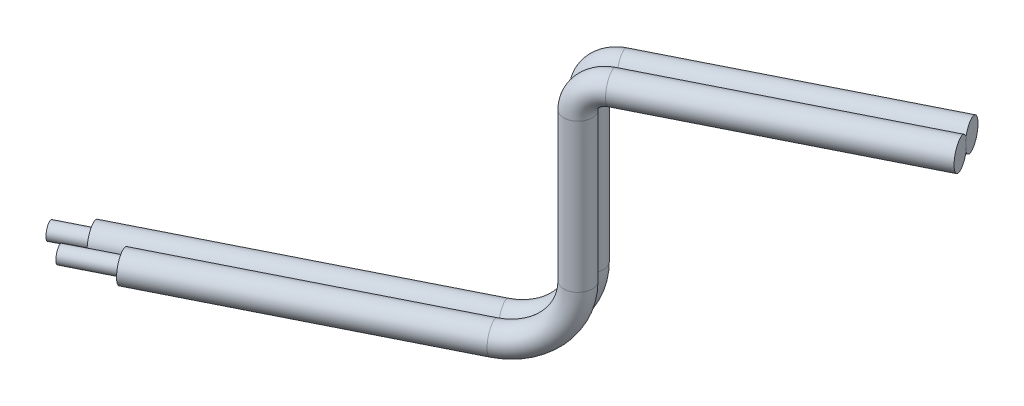
ISO-10303-21;
HEADER;
FILE_DESCRIPTION(('STEP AP214'),'2;1');
FILE_NAME('part.step','',(''),(''),'','','');
FILE_SCHEMA(('AUTOMOTIVE_DESIGN { 1 0 10303 214 1 1 1 1 }'));
ENDSEC;
DATA;
#1=APPLICATION_CONTEXT('core data for automotive mechanical design processes');
#2=APPLICATION_PROTOCOL_DEFINITION('international standard','automotive_design',2000,#1);
#3=PRODUCT_CONTEXT('',#1,'mechanical');
#4=PRODUCT('Part','Part','',(#3));
#5=PRODUCT_RELATED_PRODUCT_CATEGORY('part','',(#4));
#6=PRODUCT_DEFINITION_FORMATION('','',#4);
#7=PRODUCT_DEFINITION_CONTEXT('part definition',#1,'design');
#8=PRODUCT_DEFINITION('design','',#6,#7);
#9=PRODUCT_DEFINITION_SHAPE('','',#8);
#10=(LENGTH_UNIT() NAMED_UNIT(*) SI_UNIT(.MILLI.,.METRE.));
#11=(NAMED_UNIT(*) PLANE_ANGLE_UNIT() SI_UNIT($,.RADIAN.));
#12=(NAMED_UNIT(*) SI_UNIT($,.STERADIAN.) SOLID_ANGLE_UNIT());
#13=UNCERTAINTY_MEASURE_WITH_UNIT(LENGTH_MEASURE(1.E-05),#10,'distance_accuracy_value','');
#14=(GEOMETRIC_REPRESENTATION_CONTEXT(3) GLOBAL_UNCERTAINTY_ASSIGNED_CONTEXT((#13)) GLOBAL_UNIT_ASSIGNED_CONTEXT((#10,
#11,#12)) REPRESENTATION_CONTEXT('',''));
#15=CARTESIAN_POINT('',(0.,0.,0.));
#16=DIRECTION('',(0.,0.,1.));
#17=DIRECTION('',(1.,0.,0.));
#18=AXIS2_PLACEMENT_3D('',#15,#16,#17);
#19=CARTESIAN_POINT('',(-5.55653442290947,-0.500000000000007,2.72878461928251));
#20=DIRECTION('',(0.89417751676947,0.,-0.44771259587372));
#21=DIRECTION('',(-0.44771259587372,0.,-0.89417751676947));
#22=AXIS2_PLACEMENT_3D('',#19,#20,#21);
#23=PLANE('',#22);
#24=CARTESIAN_POINT('',(-5.55653442290946,-0.500000000000005,2.72878461928252));
#25=DIRECTION('',(-0.89417751676947,0.,0.44771259587372));
#26=DIRECTION('',(0.44771259587372,0.,0.89417751676947));
#27=AXIS2_PLACEMENT_3D('',#24,#25,#26);
#28=CIRCLE('',#27,0.45);
#29=CARTESIAN_POINT('',(-5.35506375476629,-0.500000000000005,3.13116450182878));
#30=VERTEX_POINT('',#29);
#31=EDGE_CURVE('P0_E17',#30,#30,#28,.T.);
#32=ORIENTED_EDGE('',*,*,#31,.F.);
#33=EDGE_LOOP('',(#32));
#34=FACE_BOUND('',#33,.T.);
#35=ADVANCED_FACE('P0_F14',(#34),#23,.T.);
#36=CARTESIAN_POINT('',(-12.9216299191255,-0.500000000000005,6.4164707460618));
#37=DIRECTION('',(-0.89417751676947,0.,0.44771259587372));
#38=DIRECTION('',(0.44771259587372,0.,0.89417751676947));
#39=AXIS2_PLACEMENT_3D('',#36,#37,#38);
#40=CYLINDRICAL_SURFACE('',#39,0.45);
#41=CARTESIAN_POINT('',(-12.9216299191255,-0.500000000000004,6.4164707460618));
#42=DIRECTION('',(-0.89417751676947,0.,0.44771259587372));
#43=DIRECTION('',(0.,1.,0.));
#44=AXIS2_PLACEMENT_3D('',#41,#42,#43);
#45=CIRCLE('',#44,0.45);
#46=CARTESIAN_POINT('',(-12.9216299191255,-0.0500000000000038,6.4164707460618));
#47=VERTEX_POINT('',#46);
#48=EDGE_CURVE('P0_E30',#47,#47,#45,.T.);
#49=ORIENTED_EDGE('',*,*,#48,.F.);
#50=EDGE_LOOP('',(#49));
#51=FACE_BOUND('',#50,.T.);
#52=ORIENTED_EDGE('',*,*,#31,.T.);
#53=EDGE_LOOP('',(#52));
#54=FACE_BOUND('',#53,.T.);
#55=ADVANCED_FACE('P0_F53',(#51,#54),#40,.T.);
#56=CARTESIAN_POINT('',(-12.9216299191255,-1.3,6.4164707460618));
#57=DIRECTION('',(0.44771259587372,0.,0.89417751676947));
#58=DIRECTION('',(-0.89417751676947,0.,0.44771259587372));
#59=AXIS2_PLACEMENT_3D('',#56,#57,#58);
#60=TOROIDAL_SURFACE('',#59,0.799999999999997,0.45);
#61=CARTESIAN_POINT('',(-13.6369719325411,-1.3,6.77464082276078));
#62=DIRECTION('',(0.,-1.,0.));
#63=DIRECTION('',(0.,0.,-1.));
#64=AXIS2_PLACEMENT_3D('',#61,#62,#63);
#65=CIRCLE('',#64,0.45);
#66=CARTESIAN_POINT('',(-13.6369719325411,-1.3,6.32464082276078));
#67=VERTEX_POINT('',#66);
#68=EDGE_CURVE('P0_E36',#67,#67,#65,.T.);
#69=ORIENTED_EDGE('',*,*,#68,.F.);
#70=EDGE_LOOP('',(#69));
#71=FACE_BOUND('',#70,.T.);
#72=ORIENTED_EDGE('',*,*,#48,.T.);
#73=EDGE_LOOP('',(#72));
#74=FACE_BOUND('',#73,.T.);
#75=ADVANCED_FACE('P0_F49',(#71,#74),#60,.T.);
#76=CARTESIAN_POINT('',(-24.5954661375921,-8.,12.2615332970159));
#77=DIRECTION('',(-0.89417751676947,0.,0.44771259587372));
#78=DIRECTION('',(0.44771259587372,0.,0.89417751676947));
#79=AXIS2_PLACEMENT_3D('',#76,#77,#78);
#80=PLANE('',#79);
#81=CARTESIAN_POINT('',(-24.5954661375921,-8.,12.2615332970159));
#82=DIRECTION('',(-0.894177516769469,0.,0.447712595873721));
#83=DIRECTION('',(0.447712595873721,0.,0.894177516769469));
#84=AXIS2_PLACEMENT_3D('',#81,#82,#83);
#85=CIRCLE('',#84,0.25);
#86=CARTESIAN_POINT('',(-24.4835379886237,-8.,12.4850776762083));
#87=VERTEX_POINT('',#86);
#88=EDGE_CURVE('P0_E34',#87,#87,#85,.F.);
#89=ORIENTED_EDGE('',*,*,#88,.F.);
#90=EDGE_LOOP('',(#89));
#91=FACE_BOUND('',#90,.T.);
#92=ADVANCED_FACE('P0_F52',(#91),#80,.T.);
#93=CARTESIAN_POINT('',(-13.6369719325411,-6.00000000000001,6.77464082276078));
#94=DIRECTION('',(0.,-1.,0.));
#95=DIRECTION('',(0.,0.,-1.));
#96=AXIS2_PLACEMENT_3D('',#93,#94,#95);
#97=CYLINDRICAL_SURFACE('',#96,0.45);
#98=CARTESIAN_POINT('',(-13.6369719325411,-6.,6.77464082276078));
#99=DIRECTION('',(0.,-1.,0.));
#100=DIRECTION('',(0.894177516769469,0.,-0.44771259587372));
#101=AXIS2_PLACEMENT_3D('',#98,#99,#100);
#102=CIRCLE('',#101,0.45);
#103=CARTESIAN_POINT('',(-13.2345920499948,-6.,6.57317015461761));
#104=VERTEX_POINT('',#103);
#105=EDGE_CURVE('P0_E33',#104,#104,#102,.T.);
#106=ORIENTED_EDGE('',*,*,#105,.F.);
#107=EDGE_LOOP('',(#106));
#108=FACE_BOUND('',#107,.T.);
#109=ORIENTED_EDGE('',*,*,#68,.T.);
#110=EDGE_LOOP('',(#109));
#111=FACE_BOUND('',#110,.T.);
#112=ADVANCED_FACE('P0_F83',(#108,#111),#97,.T.);
#113=CARTESIAN_POINT('',(-23.2541998624379,-8.,11.5899644032053));
#114=DIRECTION('',(-0.894177516769469,0.,0.447712595873721));
#115=DIRECTION('',(0.447712595873721,0.,0.894177516769469));
#116=AXIS2_PLACEMENT_3D('',#113,#114,#115);
#117=CYLINDRICAL_SURFACE('',#116,0.25);
#118=CARTESIAN_POINT('',(-23.2541998624379,-8.,11.5899644032053));
#119=DIRECTION('',(-0.894177516769469,0.,0.447712595873721));
#120=DIRECTION('',(0.447712595873721,0.,0.894177516769469));
#121=AXIS2_PLACEMENT_3D('',#118,#119,#120);
#122=CIRCLE('',#121,0.25);
#123=CARTESIAN_POINT('',(-23.1422717134695,-8.,11.8135087823977));
#124=VERTEX_POINT('',#123);
#125=EDGE_CURVE('P0_E26',#124,#124,#122,.T.);
#126=ORIENTED_EDGE('',*,*,#125,.T.);
#127=EDGE_LOOP('',(#126));
#128=FACE_BOUND('',#127,.T.);
#129=ORIENTED_EDGE('',*,*,#88,.T.);
#130=EDGE_LOOP('',(#129));
#131=FACE_BOUND('',#130,.T.);
#132=ADVANCED_FACE('P0_F79',(#128,#131),#117,.T.);
#133=CARTESIAN_POINT('',(-15.42532696608,-6.,7.67006601450822));
#134=DIRECTION('',(-0.44771259587372,0.,-0.89417751676947));
#135=DIRECTION('',(0.89417751676947,0.,-0.44771259587372));
#136=AXIS2_PLACEMENT_3D('',#133,#134,#135);
#137=TOROIDAL_SURFACE('',#136,2.,0.45);
#138=CARTESIAN_POINT('',(-15.42532696608,-8.,7.67006601450817));
#139=DIRECTION('',(-0.89417751676947,0.,0.44771259587372));
#140=DIRECTION('',(0.44771259587372,0.,0.89417751676947));
#141=AXIS2_PLACEMENT_3D('',#138,#139,#140);
#142=CIRCLE('',#141,0.45);
#143=CARTESIAN_POINT('',(-15.2238562979368,-8.,8.07244589705443));
#144=VERTEX_POINT('',#143);
#145=EDGE_CURVE('P0_E21',#144,#144,#142,.T.);
#146=ORIENTED_EDGE('',*,*,#145,.F.);
#147=EDGE_LOOP('',(#146));
#148=FACE_BOUND('',#147,.T.);
#149=ORIENTED_EDGE('',*,*,#105,.T.);
#150=EDGE_LOOP('',(#149));
#151=FACE_BOUND('',#150,.T.);
#152=ADVANCED_FACE('P0_F72',(#148,#151),#137,.T.);
#153=CARTESIAN_POINT('',(-23.2541998624379,-8.,11.5899644032053));
#154=DIRECTION('',(0.89417751676947,0.,-0.44771259587372));
#155=DIRECTION('',(-0.44771259587372,0.,-0.89417751676947));
#156=AXIS2_PLACEMENT_3D('',#153,#154,#155);
#157=PLANE('',#156);
#158=ORIENTED_EDGE('',*,*,#125,.F.);
#159=EDGE_LOOP('',(#158));
#160=FACE_BOUND('',#159,.T.);
#161=CARTESIAN_POINT('',(-23.2541998624379,-8.,11.5899644032053));
#162=DIRECTION('',(-0.89417751676947,0.,0.44771259587372));
#163=DIRECTION('',(0.44771259587372,0.,0.89417751676947));
#164=AXIS2_PLACEMENT_3D('',#161,#162,#163);
#165=CIRCLE('',#164,0.45);
#166=CARTESIAN_POINT('',(-23.0527291942947,-8.,11.9923442857515));
#167=VERTEX_POINT('',#166);
#168=EDGE_CURVE('P0_E10',#167,#167,#165,.F.);
#169=ORIENTED_EDGE('',*,*,#168,.F.);
#170=EDGE_LOOP('',(#169));
#171=FACE_BOUND('',#170,.T.);
#172=ADVANCED_FACE('P0_F67',(#160,#171),#157,.F.);
#173=CARTESIAN_POINT('',(-24.1143986335702,-8.,12.0206639204358));
#174=DIRECTION('',(-0.89417751676947,0.,0.44771259587372));
#175=DIRECTION('',(0.44771259587372,0.,0.89417751676947));
#176=AXIS2_PLACEMENT_3D('',#173,#174,#175);
#177=CYLINDRICAL_SURFACE('',#176,0.45);
#178=ORIENTED_EDGE('',*,*,#168,.T.);
#179=EDGE_LOOP('',(#178));
#180=FACE_BOUND('',#179,.T.);
#181=ORIENTED_EDGE('',*,*,#145,.T.);
#182=EDGE_LOOP('',(#181));
#183=FACE_BOUND('',#182,.T.);
#184=ADVANCED_FACE('P0_F65',(#180,#183),#177,.T.);
#185=CLOSED_SHELL('',(#35,#55,#75,#92,#112,#132,#152,#172,#184));
#186=MANIFOLD_SOLID_BREP('P0_B1',#185);
#187=CARTESIAN_POINT('',(-5.91470449960845,-0.500000000000007,2.01344260586693));
#188=DIRECTION('',(-0.89417751676947,0.,0.44771259587372));
#189=DIRECTION('',(0.44771259587372,0.,0.89417751676947));
#190=AXIS2_PLACEMENT_3D('',#187,#188,#189);
#191=PLANE('',#190);
#192=CARTESIAN_POINT('',(-5.91470449960845,-0.500000000000005,2.01344260586693));
#193=DIRECTION('',(0.89417751676947,0.,-0.44771259587372));
#194=DIRECTION('',(-0.44771259587372,0.,-0.89417751676947));
#195=AXIS2_PLACEMENT_3D('',#192,#193,#194);
#196=CIRCLE('',#195,0.45);
#197=CARTESIAN_POINT('',(-6.11617516775162,-0.500000000000005,1.61106272332067));
#198=VERTEX_POINT('',#197);
#199=EDGE_CURVE('P1_E17',#198,#198,#196,.F.);
#200=ORIENTED_EDGE('',*,*,#199,.F.);
#201=EDGE_LOOP('',(#200));
#202=FACE_BOUND('',#201,.T.);
#203=ADVANCED_FACE('P1_F14',(#202),#191,.F.);
#204=CARTESIAN_POINT('',(-13.2797999958245,-0.500000000000005,5.70112873264622));
#205=DIRECTION('',(0.89417751676947,0.,-0.44771259587372));
#206=DIRECTION('',(-0.44771259587372,0.,-0.89417751676947));
#207=AXIS2_PLACEMENT_3D('',#204,#205,#206);
#208=CYLINDRICAL_SURFACE('',#207,0.45);
#209=CARTESIAN_POINT('',(-13.2797999958245,-0.5,5.70112873264622));
#210=DIRECTION('',(0.89417751676947,0.,-0.44771259587372));
#211=DIRECTION('',(0.,1.,0.));
#212=AXIS2_PLACEMENT_3D('',#209,#210,#211);
#213=CIRCLE('',#212,0.45);
#214=CARTESIAN_POINT('',(-13.2797999958245,-0.0500000000000003,5.70112873264622));
#215=VERTEX_POINT('',#214);
#216=EDGE_CURVE('P1_E30',#215,#215,#213,.F.);
#217=ORIENTED_EDGE('',*,*,#216,.F.);
#218=EDGE_LOOP('',(#217));
#219=FACE_BOUND('',#218,.T.);
#220=ORIENTED_EDGE('',*,*,#199,.T.);
#221=EDGE_LOOP('',(#220));
#222=FACE_BOUND('',#221,.T.);
#223=ADVANCED_FACE('P1_F53',(#219,#222),#208,.T.);
#224=CARTESIAN_POINT('',(-13.2797999958245,-1.3,5.70112873264622));
#225=DIRECTION('',(-0.44771259587372,0.,-0.89417751676947));
#226=DIRECTION('',(-0.89417751676947,0.,0.44771259587372));
#227=AXIS2_PLACEMENT_3D('',#224,#225,#226);
#228=TOROIDAL_SURFACE('',#227,0.799999999999999,0.45);
#229=CARTESIAN_POINT('',(-13.9951420092401,-1.3,6.0592988093452));
#230=DIRECTION('',(0.,1.,0.));
#231=DIRECTION('',(0.,0.,1.));
#232=AXIS2_PLACEMENT_3D('',#229,#230,#231);
#233=CIRCLE('',#232,0.45);
#234=CARTESIAN_POINT('',(-13.9951420092401,-1.3,6.5092988093452));
#235=VERTEX_POINT('',#234);
#236=EDGE_CURVE('P1_E36',#235,#235,#233,.F.);
#237=ORIENTED_EDGE('',*,*,#236,.F.);
#238=EDGE_LOOP('',(#237));
#239=FACE_BOUND('',#238,.T.);
#240=ORIENTED_EDGE('',*,*,#216,.T.);
#241=EDGE_LOOP('',(#240));
#242=FACE_BOUND('',#241,.T.);
#243=ADVANCED_FACE('P1_F49',(#239,#242),#228,.T.);
#244=CARTESIAN_POINT('',(-25.4007249726759,-8.,11.7700475815372));
#245=DIRECTION('',(-0.89417751676947,0.,0.44771259587372));
#246=DIRECTION('',(0.44771259587372,0.,0.89417751676947));
#247=AXIS2_PLACEMENT_3D('',#244,#245,#246);
#248=PLANE('',#247);
#249=CARTESIAN_POINT('',(-25.4007249726759,-8.,11.7700475815372));
#250=DIRECTION('',(-0.89417751676947,0.,0.44771259587372));
#251=DIRECTION('',(0.44771259587372,0.,0.89417751676947));
#252=AXIS2_PLACEMENT_3D('',#249,#250,#251);
#253=CIRCLE('',#252,0.25);
#254=CARTESIAN_POINT('',(-25.2887968237075,-8.,11.9935919607295));
#255=VERTEX_POINT('',#254);
#256=EDGE_CURVE('P1_E34',#255,#255,#253,.F.);
#257=ORIENTED_EDGE('',*,*,#256,.F.);
#258=EDGE_LOOP('',(#257));
#259=FACE_BOUND('',#258,.T.);
#260=ADVANCED_FACE('P1_F52',(#259),#248,.T.);
#261=CARTESIAN_POINT('',(-13.9951420092401,-6.00000000000001,6.0592988093452));
#262=DIRECTION('',(0.,1.,0.));
#263=DIRECTION('',(0.,0.,1.));
#264=AXIS2_PLACEMENT_3D('',#261,#262,#263);
#265=CYLINDRICAL_SURFACE('',#264,0.45);
#266=CARTESIAN_POINT('',(-13.9951420092401,-6.,6.0592988093452));
#267=DIRECTION('',(0.,1.,0.));
#268=DIRECTION('',(0.894177516769469,0.,-0.44771259587372));
#269=AXIS2_PLACEMENT_3D('',#266,#267,#268);
#270=CIRCLE('',#269,0.45);
#271=CARTESIAN_POINT('',(-13.5927621266938,-6.,5.85782814120203));
#272=VERTEX_POINT('',#271);
#273=EDGE_CURVE('P1_E33',#272,#272,#270,.F.);
#274=ORIENTED_EDGE('',*,*,#273,.F.);
#275=EDGE_LOOP('',(#274));
#276=FACE_BOUND('',#275,.T.);
#277=ORIENTED_EDGE('',*,*,#236,.T.);
#278=EDGE_LOOP('',(#277));
#279=FACE_BOUND('',#278,.T.);
#280=ADVANCED_FACE('P1_F83',(#276,#279),#265,.T.);
#281=CARTESIAN_POINT('',(-23.6123699391369,-8.,10.8746223897897));
#282=DIRECTION('',(-0.89417751676947,0.,0.44771259587372));
#283=DIRECTION('',(0.44771259587372,0.,0.89417751676947));
#284=AXIS2_PLACEMENT_3D('',#281,#282,#283);
#285=CYLINDRICAL_SURFACE('',#284,0.25);
#286=CARTESIAN_POINT('',(-24.4725687102691,-8.,11.3053219070202));
#287=DIRECTION('',(-0.89417751676947,0.,0.44771259587372));
#288=DIRECTION('',(0.44771259587372,0.,0.89417751676947));
#289=AXIS2_PLACEMENT_3D('',#286,#287,#288);
#290=CIRCLE('',#289,0.25);
#291=CARTESIAN_POINT('',(-24.3606405613007,-8.,11.5288662862126));
#292=VERTEX_POINT('',#291);
#293=EDGE_CURVE('P1_E26',#292,#292,#290,.F.);
#294=ORIENTED_EDGE('',*,*,#293,.F.);
#295=EDGE_LOOP('',(#294));
#296=FACE_BOUND('',#295,.T.);
#297=ORIENTED_EDGE('',*,*,#256,.T.);
#298=EDGE_LOOP('',(#297));
#299=FACE_BOUND('',#298,.T.);
#300=ADVANCED_FACE('P1_F79',(#296,#299),#285,.T.);
#301=CARTESIAN_POINT('',(-15.783497042779,-6.,6.95472400109264));
#302=DIRECTION('',(0.44771259587372,0.,0.89417751676947));
#303=DIRECTION('',(0.89417751676947,0.,-0.44771259587372));
#304=AXIS2_PLACEMENT_3D('',#301,#302,#303);
#305=TOROIDAL_SURFACE('',#304,2.,0.45);
#306=CARTESIAN_POINT('',(-15.783497042779,-8.,6.95472400109262));
#307=DIRECTION('',(0.89417751676947,0.,-0.44771259587372));
#308=DIRECTION('',(-0.44771259587372,0.,-0.89417751676947));
#309=AXIS2_PLACEMENT_3D('',#306,#307,#308);
#310=CIRCLE('',#309,0.45);
#311=CARTESIAN_POINT('',(-15.9849677109222,-8.,6.55234411854636));
#312=VERTEX_POINT('',#311);
#313=EDGE_CURVE('P1_E21',#312,#312,#310,.F.);
#314=ORIENTED_EDGE('',*,*,#313,.F.);
#315=EDGE_LOOP('',(#314));
#316=FACE_BOUND('',#315,.T.);
#317=ORIENTED_EDGE('',*,*,#273,.T.);
#318=EDGE_LOOP('',(#317));
#319=FACE_BOUND('',#318,.T.);
#320=ADVANCED_FACE('P1_F72',(#316,#319),#305,.T.);
#321=CARTESIAN_POINT('',(-24.4725687102691,-8.,11.3053219070202));
#322=DIRECTION('',(-0.89417751676947,0.,0.44771259587372));
#323=DIRECTION('',(0.44771259587372,0.,0.89417751676947));
#324=AXIS2_PLACEMENT_3D('',#321,#322,#323);
#325=PLANE('',#324);
#326=ORIENTED_EDGE('',*,*,#293,.T.);
#327=EDGE_LOOP('',(#326));
#328=FACE_BOUND('',#327,.T.);
#329=CARTESIAN_POINT('',(-24.4725687102691,-8.,11.3053219070202));
#330=DIRECTION('',(0.89417751676947,0.,-0.44771259587372));
#331=DIRECTION('',(-0.44771259587372,0.,-0.89417751676947));
#332=AXIS2_PLACEMENT_3D('',#329,#330,#331);
#333=CIRCLE('',#332,0.45);
#334=CARTESIAN_POINT('',(-24.6740393784123,-8.,10.9029420244739));
#335=VERTEX_POINT('',#334);
#336=EDGE_CURVE('P1_E10',#335,#335,#333,.T.);
#337=ORIENTED_EDGE('',*,*,#336,.F.);
#338=EDGE_LOOP('',(#337));
#339=FACE_BOUND('',#338,.T.);
#340=ADVANCED_FACE('P1_F67',(#328,#339),#325,.T.);
#341=CARTESIAN_POINT('',(-24.4725687102691,-8.,11.3053219070202));
#342=DIRECTION('',(0.89417751676947,0.,-0.44771259587372));
#343=DIRECTION('',(-0.44771259587372,0.,-0.89417751676947));
#344=AXIS2_PLACEMENT_3D('',#341,#342,#343);
#345=CYLINDRICAL_SURFACE('',#344,0.45);
#346=ORIENTED_EDGE('',*,*,#336,.T.);
#347=EDGE_LOOP('',(#346));
#348=FACE_BOUND('',#347,.T.);
#349=ORIENTED_EDGE('',*,*,#313,.T.);
#350=EDGE_LOOP('',(#349));
#351=FACE_BOUND('',#350,.T.);
#352=ADVANCED_FACE('P1_F65',(#348,#351),#345,.T.);
#353=CLOSED_SHELL('',(#203,#223,#243,#260,#280,#300,#320,#340,#352));
#354=MANIFOLD_SOLID_BREP('P1_B1',#353);
#355=ADVANCED_BREP_SHAPE_REPRESENTATION('',(#18,#186,#354),#14);
#356=SHAPE_DEFINITION_REPRESENTATION(#9,#355);
ENDSEC;
END-ISO-10303-21;
